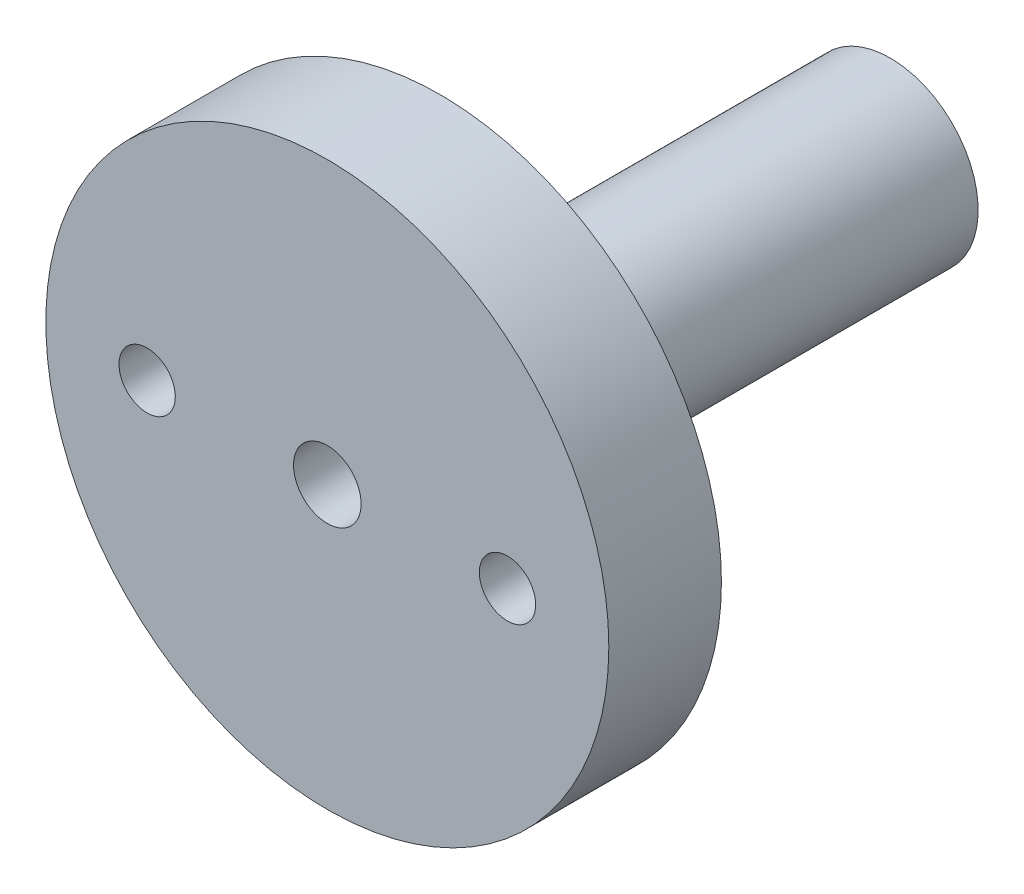
ISO-10303-21;
HEADER;
FILE_DESCRIPTION(('STEP AP214'),'2;1');
FILE_NAME('part.step','',(''),(''),'','','');
FILE_SCHEMA(('AUTOMOTIVE_DESIGN { 1 0 10303 214 1 1 1 1 }'));
ENDSEC;
DATA;
#1=APPLICATION_CONTEXT('core data for automotive mechanical design processes');
#2=APPLICATION_PROTOCOL_DEFINITION('international standard','automotive_design',2000,#1);
#3=PRODUCT_CONTEXT('',#1,'mechanical');
#4=PRODUCT('Part','Part','',(#3));
#5=PRODUCT_RELATED_PRODUCT_CATEGORY('part','',(#4));
#6=PRODUCT_DEFINITION_FORMATION('','',#4);
#7=PRODUCT_DEFINITION_CONTEXT('part definition',#1,'design');
#8=PRODUCT_DEFINITION('design','',#6,#7);
#9=PRODUCT_DEFINITION_SHAPE('','',#8);
#10=(LENGTH_UNIT() NAMED_UNIT(*) SI_UNIT(.MILLI.,.METRE.));
#11=(NAMED_UNIT(*) PLANE_ANGLE_UNIT() SI_UNIT($,.RADIAN.));
#12=(NAMED_UNIT(*) SI_UNIT($,.STERADIAN.) SOLID_ANGLE_UNIT());
#13=UNCERTAINTY_MEASURE_WITH_UNIT(LENGTH_MEASURE(1.E-05),#10,'distance_accuracy_value','');
#14=(GEOMETRIC_REPRESENTATION_CONTEXT(3) GLOBAL_UNCERTAINTY_ASSIGNED_CONTEXT((#13)) GLOBAL_UNIT_ASSIGNED_CONTEXT((#10,
#11,#12)) REPRESENTATION_CONTEXT('',''));
#15=CARTESIAN_POINT('',(0.,0.,0.));
#16=DIRECTION('',(0.,0.,1.));
#17=DIRECTION('',(1.,0.,0.));
#18=AXIS2_PLACEMENT_3D('',#15,#16,#17);
#19=CARTESIAN_POINT('',(0.,0.,5.));
#20=DIRECTION('',(0.,0.,-1.));
#21=DIRECTION('',(-1.,0.,0.));
#22=AXIS2_PLACEMENT_3D('',#19,#20,#21);
#23=CYLINDRICAL_SURFACE('',#22,12.5);
#24=CARTESIAN_POINT('',(0.,0.,5.));
#25=DIRECTION('',(0.,0.,1.));
#26=DIRECTION('',(1.,0.,0.));
#27=AXIS2_PLACEMENT_3D('',#24,#25,#26);
#28=CIRCLE('',#27,12.5);
#29=CARTESIAN_POINT('',(12.5,0.,5.));
#30=VERTEX_POINT('',#29);
#31=EDGE_CURVE('E38',#30,#30,#28,.T.);
#32=ORIENTED_EDGE('',*,*,#31,.F.);
#33=EDGE_LOOP('',(#32));
#34=FACE_BOUND('',#33,.T.);
#35=CARTESIAN_POINT('',(0.,0.,0.));
#36=DIRECTION('',(0.,0.,1.));
#37=DIRECTION('',(1.,0.,0.));
#38=AXIS2_PLACEMENT_3D('',#35,#36,#37);
#39=CIRCLE('',#38,12.5);
#40=CARTESIAN_POINT('',(12.5,0.,0.));
#41=VERTEX_POINT('',#40);
#42=EDGE_CURVE('E43',#41,#41,#39,.T.);
#43=ORIENTED_EDGE('',*,*,#42,.T.);
#44=EDGE_LOOP('',(#43));
#45=FACE_BOUND('',#44,.T.);
#46=ADVANCED_FACE('F31',(#34,#45),#23,.T.);
#47=CARTESIAN_POINT('',(0.,0.,5.));
#48=DIRECTION('',(0.,0.,1.));
#49=DIRECTION('',(1.,0.,0.));
#50=AXIS2_PLACEMENT_3D('',#47,#48,#49);
#51=PLANE('',#50);
#52=CARTESIAN_POINT('',(8.,0.,5.));
#53=DIRECTION('',(0.,0.,1.));
#54=DIRECTION('',(1.,0.,0.));
#55=AXIS2_PLACEMENT_3D('',#52,#53,#54);
#56=CIRCLE('',#55,1.25);
#57=CARTESIAN_POINT('',(9.25,0.,5.));
#58=VERTEX_POINT('',#57);
#59=EDGE_CURVE('E52',#58,#58,#56,.T.);
#60=ORIENTED_EDGE('',*,*,#59,.F.);
#61=EDGE_LOOP('',(#60));
#62=FACE_BOUND('',#61,.T.);
#63=CARTESIAN_POINT('',(-8.,0.,5.));
#64=DIRECTION('',(0.,0.,1.));
#65=DIRECTION('',(1.,0.,0.));
#66=AXIS2_PLACEMENT_3D('',#63,#64,#65);
#67=CIRCLE('',#66,1.25);
#68=CARTESIAN_POINT('',(-6.75,0.,5.));
#69=VERTEX_POINT('',#68);
#70=EDGE_CURVE('E58',#69,#69,#67,.T.);
#71=ORIENTED_EDGE('',*,*,#70,.F.);
#72=EDGE_LOOP('',(#71));
#73=FACE_BOUND('',#72,.T.);
#74=CARTESIAN_POINT('',(0.,0.,5.));
#75=DIRECTION('',(0.,0.,1.));
#76=DIRECTION('',(1.,0.,0.));
#77=AXIS2_PLACEMENT_3D('',#74,#75,#76);
#78=CIRCLE('',#77,1.5);
#79=CARTESIAN_POINT('',(1.5,0.,5.));
#80=VERTEX_POINT('',#79);
#81=EDGE_CURVE('E56',#80,#80,#78,.T.);
#82=ORIENTED_EDGE('',*,*,#81,.F.);
#83=EDGE_LOOP('',(#82));
#84=FACE_BOUND('',#83,.T.);
#85=ORIENTED_EDGE('',*,*,#31,.T.);
#86=EDGE_LOOP('',(#85));
#87=FACE_BOUND('',#86,.T.);
#88=ADVANCED_FACE('F72',(#62,#73,#84,#87),#51,.T.);
#89=CARTESIAN_POINT('',(0.,0.,0.));
#90=DIRECTION('',(0.,0.,1.));
#91=DIRECTION('',(1.,0.,0.));
#92=AXIS2_PLACEMENT_3D('',#89,#90,#91);
#93=PLANE('',#92);
#94=CARTESIAN_POINT('',(8.,0.,0.));
#95=DIRECTION('',(0.,0.,1.));
#96=DIRECTION('',(1.,0.,0.));
#97=AXIS2_PLACEMENT_3D('',#94,#95,#96);
#98=CIRCLE('',#97,1.25);
#99=CARTESIAN_POINT('',(9.25,0.,0.));
#100=VERTEX_POINT('',#99);
#101=EDGE_CURVE('E34',#100,#100,#98,.T.);
#102=ORIENTED_EDGE('',*,*,#101,.T.);
#103=EDGE_LOOP('',(#102));
#104=FACE_BOUND('',#103,.T.);
#105=CARTESIAN_POINT('',(-8.,0.,0.));
#106=DIRECTION('',(0.,0.,1.));
#107=DIRECTION('',(1.,0.,0.));
#108=AXIS2_PLACEMENT_3D('',#105,#106,#107);
#109=CIRCLE('',#108,1.25);
#110=CARTESIAN_POINT('',(-6.75,0.,0.));
#111=VERTEX_POINT('',#110);
#112=EDGE_CURVE('E50',#111,#111,#109,.T.);
#113=ORIENTED_EDGE('',*,*,#112,.T.);
#114=EDGE_LOOP('',(#113));
#115=FACE_BOUND('',#114,.T.);
#116=CARTESIAN_POINT('',(0.,0.,0.));
#117=DIRECTION('',(0.,0.,-1.));
#118=DIRECTION('',(-1.,0.,0.));
#119=AXIS2_PLACEMENT_3D('',#116,#117,#118);
#120=CIRCLE('',#119,3.9);
#121=CARTESIAN_POINT('',(-3.9,0.,0.));
#122=VERTEX_POINT('',#121);
#123=EDGE_CURVE('E10',#122,#122,#120,.T.);
#124=ORIENTED_EDGE('',*,*,#123,.F.);
#125=EDGE_LOOP('',(#124));
#126=FACE_BOUND('',#125,.T.);
#127=ORIENTED_EDGE('',*,*,#42,.F.);
#128=EDGE_LOOP('',(#127));
#129=FACE_BOUND('',#128,.T.);
#130=ADVANCED_FACE('F75',(#104,#115,#126,#129),#93,.F.);
#131=CARTESIAN_POINT('',(0.,0.,-20.));
#132=DIRECTION('',(0.,0.,1.));
#133=DIRECTION('',(1.,0.,0.));
#134=AXIS2_PLACEMENT_3D('',#131,#132,#133);
#135=CYLINDRICAL_SURFACE('',#134,3.9);
#136=CARTESIAN_POINT('',(0.,0.,-20.));
#137=DIRECTION('',(0.,0.,-1.));
#138=DIRECTION('',(-1.,0.,0.));
#139=AXIS2_PLACEMENT_3D('',#136,#137,#138);
#140=CIRCLE('',#139,3.9);
#141=CARTESIAN_POINT('',(-3.9,0.,-20.));
#142=VERTEX_POINT('',#141);
#143=EDGE_CURVE('E46',#142,#142,#140,.T.);
#144=ORIENTED_EDGE('',*,*,#143,.F.);
#145=EDGE_LOOP('',(#144));
#146=FACE_BOUND('',#145,.T.);
#147=ORIENTED_EDGE('',*,*,#123,.T.);
#148=EDGE_LOOP('',(#147));
#149=FACE_BOUND('',#148,.T.);
#150=ADVANCED_FACE('F85',(#146,#149),#135,.T.);
#151=CARTESIAN_POINT('',(0.,0.,-20.));
#152=DIRECTION('',(0.,0.,-1.));
#153=DIRECTION('',(-1.,0.,0.));
#154=AXIS2_PLACEMENT_3D('',#151,#152,#153);
#155=PLANE('',#154);
#156=ORIENTED_EDGE('',*,*,#143,.T.);
#157=EDGE_LOOP('',(#156));
#158=FACE_BOUND('',#157,.T.);
#159=ADVANCED_FACE('F91',(#158),#155,.T.);
#160=CARTESIAN_POINT('',(0.,0.,2.));
#161=DIRECTION('',(0.,0.,1.));
#162=DIRECTION('',(1.,0.,0.));
#163=AXIS2_PLACEMENT_3D('',#160,#161,#162);
#164=CYLINDRICAL_SURFACE('',#163,1.5);
#165=CARTESIAN_POINT('',(0.,0.,2.));
#166=DIRECTION('',(0.,0.,1.));
#167=DIRECTION('',(1.,0.,0.));
#168=AXIS2_PLACEMENT_3D('',#165,#166,#167);
#169=CIRCLE('',#168,1.5);
#170=CARTESIAN_POINT('',(1.5,0.,2.));
#171=VERTEX_POINT('',#170);
#172=EDGE_CURVE('E65',#171,#171,#169,.T.);
#173=ORIENTED_EDGE('',*,*,#172,.F.);
#174=EDGE_LOOP('',(#173));
#175=FACE_BOUND('',#174,.T.);
#176=ORIENTED_EDGE('',*,*,#81,.T.);
#177=EDGE_LOOP('',(#176));
#178=FACE_BOUND('',#177,.T.);
#179=ADVANCED_FACE('F70',(#175,#178),#164,.F.);
#180=CARTESIAN_POINT('',(0.,0.,2.));
#181=DIRECTION('',(0.,0.,1.));
#182=DIRECTION('',(1.,0.,0.));
#183=AXIS2_PLACEMENT_3D('',#180,#181,#182);
#184=PLANE('',#183);
#185=ORIENTED_EDGE('',*,*,#172,.T.);
#186=EDGE_LOOP('',(#185));
#187=FACE_BOUND('',#186,.T.);
#188=ADVANCED_FACE('F100',(#187),#184,.T.);
#189=CARTESIAN_POINT('',(-8.,0.,-5.));
#190=DIRECTION('',(0.,0.,1.));
#191=DIRECTION('',(1.,0.,0.));
#192=AXIS2_PLACEMENT_3D('',#189,#190,#191);
#193=CYLINDRICAL_SURFACE('',#192,1.25);
#194=ORIENTED_EDGE('',*,*,#70,.T.);
#195=EDGE_LOOP('',(#194));
#196=FACE_BOUND('',#195,.T.);
#197=ORIENTED_EDGE('',*,*,#112,.F.);
#198=EDGE_LOOP('',(#197));
#199=FACE_BOUND('',#198,.T.);
#200=ADVANCED_FACE('F104',(#196,#199),#193,.F.);
#201=CARTESIAN_POINT('',(8.,0.,-5.));
#202=DIRECTION('',(0.,0.,1.));
#203=DIRECTION('',(1.,0.,0.));
#204=AXIS2_PLACEMENT_3D('',#201,#202,#203);
#205=CYLINDRICAL_SURFACE('',#204,1.25);
#206=ORIENTED_EDGE('',*,*,#59,.T.);
#207=EDGE_LOOP('',(#206));
#208=FACE_BOUND('',#207,.T.);
#209=ORIENTED_EDGE('',*,*,#101,.F.);
#210=EDGE_LOOP('',(#209));
#211=FACE_BOUND('',#210,.T.);
#212=ADVANCED_FACE('F108',(#208,#211),#205,.F.);
#213=CLOSED_SHELL('',(#46,#88,#130,#150,#159,#179,#188,#200,#212));
#214=MANIFOLD_SOLID_BREP('B2',#213);
#215=ADVANCED_BREP_SHAPE_REPRESENTATION('',(#18,#214),#14);
#216=SHAPE_DEFINITION_REPRESENTATION(#9,#215);
ENDSEC;
END-ISO-10303-21;
